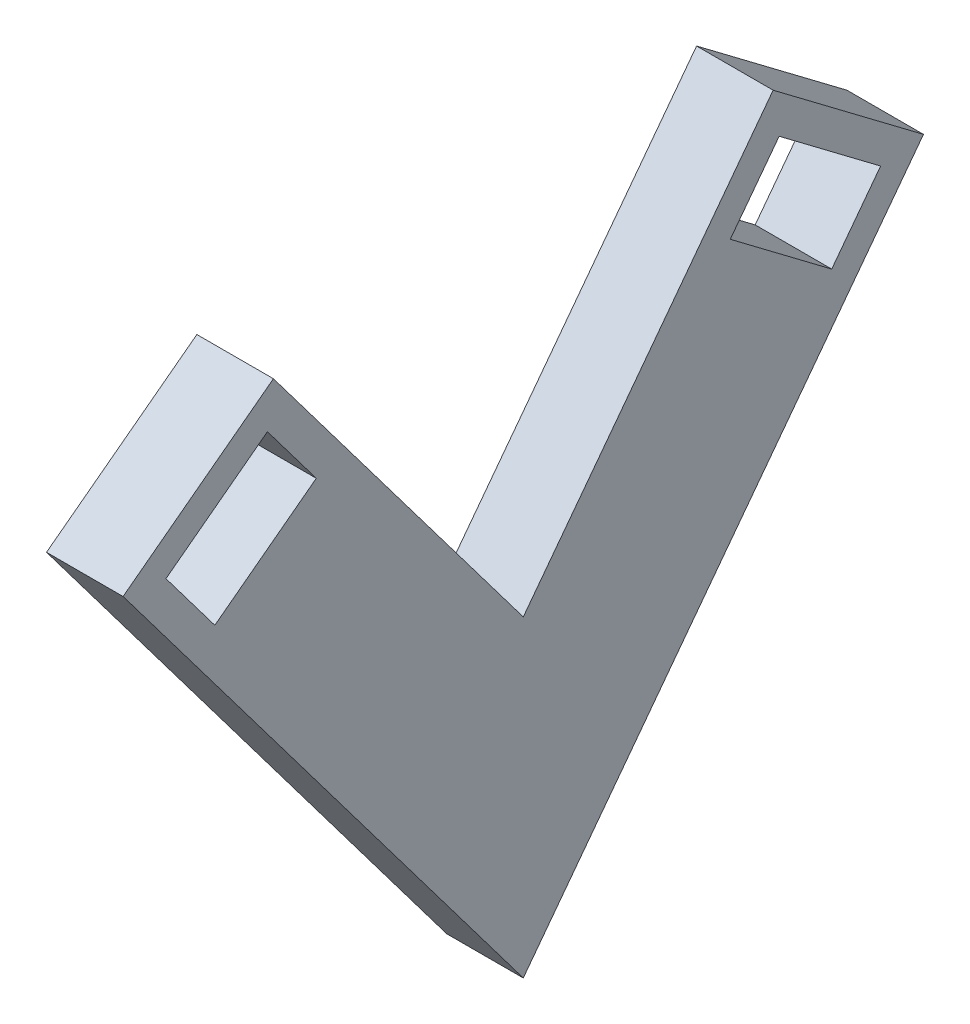
ISO-10303-21;
HEADER;
FILE_DESCRIPTION(('STEP AP214'),'2;1');
FILE_NAME('part.step','',(''),(''),'','','');
FILE_SCHEMA(('AUTOMOTIVE_DESIGN { 1 0 10303 214 1 1 1 1 }'));
ENDSEC;
DATA;
#1=APPLICATION_CONTEXT('core data for automotive mechanical design processes');
#2=APPLICATION_PROTOCOL_DEFINITION('international standard','automotive_design',2000,#1);
#3=PRODUCT_CONTEXT('',#1,'mechanical');
#4=PRODUCT('Part','Part','',(#3));
#5=PRODUCT_RELATED_PRODUCT_CATEGORY('part','',(#4));
#6=PRODUCT_DEFINITION_FORMATION('','',#4);
#7=PRODUCT_DEFINITION_CONTEXT('part definition',#1,'design');
#8=PRODUCT_DEFINITION('design','',#6,#7);
#9=PRODUCT_DEFINITION_SHAPE('','',#8);
#10=(LENGTH_UNIT() NAMED_UNIT(*) SI_UNIT(.MILLI.,.METRE.));
#11=(NAMED_UNIT(*) PLANE_ANGLE_UNIT() SI_UNIT($,.RADIAN.));
#12=(NAMED_UNIT(*) SI_UNIT($,.STERADIAN.) SOLID_ANGLE_UNIT());
#13=UNCERTAINTY_MEASURE_WITH_UNIT(LENGTH_MEASURE(1.E-05),#10,'distance_accuracy_value','');
#14=(GEOMETRIC_REPRESENTATION_CONTEXT(3) GLOBAL_UNCERTAINTY_ASSIGNED_CONTEXT((#13)) GLOBAL_UNIT_ASSIGNED_CONTEXT((#10,
#11,#12)) REPRESENTATION_CONTEXT('',''));
#15=CARTESIAN_POINT('',(0.,0.,0.));
#16=DIRECTION('',(0.,0.,1.));
#17=DIRECTION('',(1.,0.,0.));
#18=AXIS2_PLACEMENT_3D('',#15,#16,#17);
#19=CARTESIAN_POINT('',(5.,0.,0.));
#20=DIRECTION('',(1.,0.,0.));
#21=DIRECTION('',(0.,0.,-1.));
#22=AXIS2_PLACEMENT_3D('',#19,#20,#21);
#23=PLANE('',#22);
#24=DIRECTION('',(0.,-0.602233105212653,0.798320290977203));
#25=VECTOR('',#24,1.);
#26=CARTESIAN_POINT('',(5.,22.1160498707739,14.5742099507505));
#27=LINE('',#26,#25);
#28=CARTESIAN_POINT('',(5.,22.1160498707739,14.5742099507505));
#29=VERTEX_POINT('',#28);
#30=CARTESIAN_POINT('',(5.,14.7085826766583,24.3935495297701));
#31=VERTEX_POINT('',#30);
#32=EDGE_CURVE('E232',#29,#31,#27,.T.);
#33=ORIENTED_EDGE('',*,*,#32,.T.);
#34=DIRECTION('',(0.,-0.798320290977203,-0.602233105212653));
#35=VECTOR('',#34,1.);
#36=CARTESIAN_POINT('',(5.,14.7085826766583,24.3935495297701));
#37=LINE('',#36,#35);
#38=CARTESIAN_POINT('',(5.,-19.9404665601385,-1.74483721848573));
#39=VERTEX_POINT('',#38);
#40=EDGE_CURVE('E235',#31,#39,#37,.T.);
#41=ORIENTED_EDGE('',*,*,#40,.T.);
#42=DIRECTION('',(0.,-0.798320290977203,0.602233105212652));
#43=VECTOR('',#42,1.);
#44=CARTESIAN_POINT('',(5.,14.7085826766583,-27.8832239667415));
#45=LINE('',#44,#43);
#46=CARTESIAN_POINT('',(5.,14.7085826766583,-27.8832239667415));
#47=VERTEX_POINT('',#46);
#48=EDGE_CURVE('E183',#47,#39,#45,.T.);
#49=ORIENTED_EDGE('',*,*,#48,.F.);
#50=DIRECTION('',(0.,-0.602233105212652,-0.798320290977203));
#51=VECTOR('',#50,1.);
#52=CARTESIAN_POINT('',(5.,22.1160498707739,-18.0638843877219));
#53=LINE('',#52,#51);
#54=CARTESIAN_POINT('',(5.,22.1160498707739,-18.0638843877219));
#55=VERTEX_POINT('',#54);
#56=EDGE_CURVE('E180',#55,#47,#53,.T.);
#57=ORIENTED_EDGE('',*,*,#56,.F.);
#58=DIRECTION('',(0.,0.798320290977203,-0.602233105212652));
#59=VECTOR('',#58,1.);
#60=CARTESIAN_POINT('',(5.,22.1160498707739,-18.0638843877219));
#61=LINE('',#60,#59);
#62=CARTESIAN_POINT('',(5.,0.483518593677922,-1.74483721848573));
#63=VERTEX_POINT('',#62);
#64=EDGE_CURVE('E187',#63,#55,#61,.T.);
#65=ORIENTED_EDGE('',*,*,#64,.F.);
#66=DIRECTION('',(0.,0.798320290977203,0.602233105212652));
#67=VECTOR('',#66,1.);
#68=CARTESIAN_POINT('',(5.,22.1160498707739,14.5742099507505));
#69=LINE('',#68,#67);
#70=EDGE_CURVE('E238',#63,#29,#69,.T.);
#71=ORIENTED_EDGE('',*,*,#70,.T.);
#72=EDGE_LOOP('',(#33,#41,#49,#57,#65,#71));
#73=FACE_BOUND('',#72,.T.);
#74=DIRECTION('',(0.,0.602233105212653,-0.798320290977203));
#75=VECTOR('',#74,1.);
#76=CARTESIAN_POINT('',(5.,10.08531076295,18.4006072797633));
#77=LINE('',#76,#75);
#78=CARTESIAN_POINT('',(5.,10.08531076295,18.4006072797633));
#79=VERTEX_POINT('',#78);
#80=CARTESIAN_POINT('',(5.,15.083845536215,11.7745488646525));
#81=VERTEX_POINT('',#80);
#82=EDGE_CURVE('E208',#79,#81,#77,.T.);
#83=ORIENTED_EDGE('',*,*,#82,.F.);
#84=DIRECTION('',(0.,-0.798320290977203,-0.602233105212652));
#85=VECTOR('',#84,1.);
#86=CARTESIAN_POINT('',(5.,14.3164083051292,21.5924427373904));
#87=LINE('',#86,#85);
#88=CARTESIAN_POINT('',(5.,14.3164083051292,21.5924427373904));
#89=VERTEX_POINT('',#88);
#90=EDGE_CURVE('E206',#89,#79,#87,.T.);
#91=ORIENTED_EDGE('',*,*,#90,.F.);
#92=DIRECTION('',(0.,-0.602233105212652,0.798320290977203));
#93=VECTOR('',#92,1.);
#94=CARTESIAN_POINT('',(5.,19.3149430783942,14.9663843222796));
#95=LINE('',#94,#93);
#96=CARTESIAN_POINT('',(5.,19.3149430783942,14.9663843222796));
#97=VERTEX_POINT('',#96);
#98=EDGE_CURVE('E213',#97,#89,#95,.T.);
#99=ORIENTED_EDGE('',*,*,#98,.F.);
#100=DIRECTION('',(0.,0.798320290977203,0.602233105212652));
#101=VECTOR('',#100,1.);
#102=CARTESIAN_POINT('',(5.,15.083845536215,11.7745488646525));
#103=LINE('',#102,#101);
#104=EDGE_CURVE('E211',#81,#97,#103,.T.);
#105=ORIENTED_EDGE('',*,*,#104,.F.);
#106=EDGE_LOOP('',(#83,#91,#99,#105));
#107=FACE_BOUND('',#106,.T.);
#108=DIRECTION('',(0.,0.602233105212652,0.798320290977203));
#109=VECTOR('',#108,1.);
#110=CARTESIAN_POINT('',(5.,10.08531076295,-21.8902817167348));
#111=LINE('',#110,#109);
#112=CARTESIAN_POINT('',(5.,10.08531076295,-21.8902817167348));
#113=VERTEX_POINT('',#112);
#114=CARTESIAN_POINT('',(5.,15.083845536215,-15.264223301624));
#115=VERTEX_POINT('',#114);
#116=EDGE_CURVE('E155',#113,#115,#111,.T.);
#117=ORIENTED_EDGE('',*,*,#116,.T.);
#118=DIRECTION('',(0.,0.798320290977204,-0.602233105212652));
#119=VECTOR('',#118,1.);
#120=CARTESIAN_POINT('',(5.,15.083845536215,-15.264223301624));
#121=LINE('',#120,#119);
#122=CARTESIAN_POINT('',(5.,19.3149430783942,-18.456058759251));
#123=VERTEX_POINT('',#122);
#124=EDGE_CURVE('E162',#115,#123,#121,.T.);
#125=ORIENTED_EDGE('',*,*,#124,.T.);
#126=DIRECTION('',(0.,-0.602233105212652,-0.798320290977203));
#127=VECTOR('',#126,1.);
#128=CARTESIAN_POINT('',(5.,19.3149430783942,-18.456058759251));
#129=LINE('',#128,#127);
#130=CARTESIAN_POINT('',(5.,14.3164083051292,-25.0821171743618));
#131=VERTEX_POINT('',#130);
#132=EDGE_CURVE('E157',#123,#131,#129,.T.);
#133=ORIENTED_EDGE('',*,*,#132,.T.);
#134=DIRECTION('',(0.,-0.798320290977203,0.602233105212652));
#135=VECTOR('',#134,1.);
#136=CARTESIAN_POINT('',(5.,14.3164083051292,-25.0821171743618));
#137=LINE('',#136,#135);
#138=EDGE_CURVE('E141',#131,#113,#137,.T.);
#139=ORIENTED_EDGE('',*,*,#138,.T.);
#140=EDGE_LOOP('',(#117,#125,#133,#139));
#141=FACE_BOUND('',#140,.T.);
#142=ADVANCED_FACE('F35',(#73,#107,#141),#23,.T.);
#143=CARTESIAN_POINT('',(0.,0.,0.));
#144=DIRECTION('',(1.,0.,0.));
#145=DIRECTION('',(0.,0.,-1.));
#146=AXIS2_PLACEMENT_3D('',#143,#144,#145);
#147=PLANE('',#146);
#148=DIRECTION('',(0.,-0.602233105212653,0.798320290977203));
#149=VECTOR('',#148,1.);
#150=CARTESIAN_POINT('',(0.,22.1160498707739,14.5742099507505));
#151=LINE('',#150,#149);
#152=CARTESIAN_POINT('',(0.,22.1160498707739,14.5742099507505));
#153=VERTEX_POINT('',#152);
#154=CARTESIAN_POINT('',(0.,14.7085826766583,24.3935495297701));
#155=VERTEX_POINT('',#154);
#156=EDGE_CURVE('E231',#153,#155,#151,.T.);
#157=ORIENTED_EDGE('',*,*,#156,.F.);
#158=DIRECTION('',(0.,0.798320290977203,0.602233105212652));
#159=VECTOR('',#158,1.);
#160=CARTESIAN_POINT('',(0.,22.1160498707739,14.5742099507505));
#161=LINE('',#160,#159);
#162=CARTESIAN_POINT('',(0.,0.483518593677922,-1.74483721848573));
#163=VERTEX_POINT('',#162);
#164=EDGE_CURVE('E236',#163,#153,#161,.T.);
#165=ORIENTED_EDGE('',*,*,#164,.F.);
#166=DIRECTION('',(0.,0.798320290977203,-0.602233105212652));
#167=VECTOR('',#166,1.);
#168=CARTESIAN_POINT('',(0.,22.1160498707739,-18.0638843877219));
#169=LINE('',#168,#167);
#170=CARTESIAN_POINT('',(0.,22.1160498707739,-18.0638843877219));
#171=VERTEX_POINT('',#170);
#172=EDGE_CURVE('E184',#163,#171,#169,.T.);
#173=ORIENTED_EDGE('',*,*,#172,.T.);
#174=DIRECTION('',(0.,-0.602233105212652,-0.798320290977203));
#175=VECTOR('',#174,1.);
#176=CARTESIAN_POINT('',(0.,22.1160498707739,-18.0638843877219));
#177=LINE('',#176,#175);
#178=CARTESIAN_POINT('',(0.,14.7085826766583,-27.8832239667415));
#179=VERTEX_POINT('',#178);
#180=EDGE_CURVE('E149',#171,#179,#177,.T.);
#181=ORIENTED_EDGE('',*,*,#180,.T.);
#182=DIRECTION('',(0.,-0.798320290977203,0.602233105212652));
#183=VECTOR('',#182,1.);
#184=CARTESIAN_POINT('',(0.,14.7085826766583,-27.8832239667415));
#185=LINE('',#184,#183);
#186=CARTESIAN_POINT('',(0.,-19.9404665601385,-1.74483721848573));
#187=VERTEX_POINT('',#186);
#188=EDGE_CURVE('E193',#179,#187,#185,.T.);
#189=ORIENTED_EDGE('',*,*,#188,.T.);
#190=DIRECTION('',(0.,-0.798320290977203,-0.602233105212653));
#191=VECTOR('',#190,1.);
#192=CARTESIAN_POINT('',(0.,14.7085826766583,24.3935495297701));
#193=LINE('',#192,#191);
#194=EDGE_CURVE('E242',#155,#187,#193,.T.);
#195=ORIENTED_EDGE('',*,*,#194,.F.);
#196=EDGE_LOOP('',(#157,#165,#173,#181,#189,#195));
#197=FACE_BOUND('',#196,.T.);
#198=DIRECTION('',(0.,-0.798320290977203,-0.602233105212652));
#199=VECTOR('',#198,1.);
#200=CARTESIAN_POINT('',(0.,14.3164083051292,21.5924427373904));
#201=LINE('',#200,#199);
#202=CARTESIAN_POINT('',(0.,14.3164083051292,21.5924427373904));
#203=VERTEX_POINT('',#202);
#204=CARTESIAN_POINT('',(0.,10.08531076295,18.4006072797633));
#205=VERTEX_POINT('',#204);
#206=EDGE_CURVE('E58',#203,#205,#201,.T.);
#207=ORIENTED_EDGE('',*,*,#206,.T.);
#208=DIRECTION('',(0.,0.602233105212653,-0.798320290977203));
#209=VECTOR('',#208,1.);
#210=CARTESIAN_POINT('',(0.,10.08531076295,18.4006072797633));
#211=LINE('',#210,#209);
#212=CARTESIAN_POINT('',(0.,15.083845536215,11.7745488646525));
#213=VERTEX_POINT('',#212);
#214=EDGE_CURVE('E217',#205,#213,#211,.T.);
#215=ORIENTED_EDGE('',*,*,#214,.T.);
#216=DIRECTION('',(0.,0.798320290977203,0.602233105212652));
#217=VECTOR('',#216,1.);
#218=CARTESIAN_POINT('',(0.,15.083845536215,11.7745488646525));
#219=LINE('',#218,#217);
#220=CARTESIAN_POINT('',(0.,19.3149430783942,14.9663843222796));
#221=VERTEX_POINT('',#220);
#222=EDGE_CURVE('E220',#213,#221,#219,.T.);
#223=ORIENTED_EDGE('',*,*,#222,.T.);
#224=DIRECTION('',(0.,-0.602233105212652,0.798320290977203));
#225=VECTOR('',#224,1.);
#226=CARTESIAN_POINT('',(0.,19.3149430783942,14.9663843222796));
#227=LINE('',#226,#225);
#228=EDGE_CURVE('E209',#221,#203,#227,.T.);
#229=ORIENTED_EDGE('',*,*,#228,.T.);
#230=EDGE_LOOP('',(#207,#215,#223,#229));
#231=FACE_BOUND('',#230,.T.);
#232=DIRECTION('',(0.,-0.798320290977203,0.602233105212652));
#233=VECTOR('',#232,1.);
#234=CARTESIAN_POINT('',(0.,14.3164083051292,-25.0821171743618));
#235=LINE('',#234,#233);
#236=CARTESIAN_POINT('',(0.,14.3164083051292,-25.0821171743618));
#237=VERTEX_POINT('',#236);
#238=CARTESIAN_POINT('',(0.,10.08531076295,-21.8902817167348));
#239=VERTEX_POINT('',#238);
#240=EDGE_CURVE('E144',#237,#239,#235,.T.);
#241=ORIENTED_EDGE('',*,*,#240,.F.);
#242=DIRECTION('',(0.,-0.602233105212652,-0.798320290977203));
#243=VECTOR('',#242,1.);
#244=CARTESIAN_POINT('',(0.,19.3149430783942,-18.456058759251));
#245=LINE('',#244,#243);
#246=CARTESIAN_POINT('',(0.,19.3149430783942,-18.456058759251));
#247=VERTEX_POINT('',#246);
#248=EDGE_CURVE('E158',#247,#237,#245,.T.);
#249=ORIENTED_EDGE('',*,*,#248,.F.);
#250=DIRECTION('',(0.,0.798320290977204,-0.602233105212652));
#251=VECTOR('',#250,1.);
#252=CARTESIAN_POINT('',(0.,15.083845536215,-15.264223301624));
#253=LINE('',#252,#251);
#254=CARTESIAN_POINT('',(0.,15.083845536215,-15.264223301624));
#255=VERTEX_POINT('',#254);
#256=EDGE_CURVE('E171',#255,#247,#253,.T.);
#257=ORIENTED_EDGE('',*,*,#256,.F.);
#258=DIRECTION('',(0.,0.602233105212652,0.798320290977203));
#259=VECTOR('',#258,1.);
#260=CARTESIAN_POINT('',(0.,10.08531076295,-21.8902817167348));
#261=LINE('',#260,#259);
#262=EDGE_CURVE('E169',#239,#255,#261,.T.);
#263=ORIENTED_EDGE('',*,*,#262,.F.);
#264=EDGE_LOOP('',(#241,#249,#257,#263));
#265=FACE_BOUND('',#264,.T.);
#266=ADVANCED_FACE('F253',(#197,#231,#265),#147,.F.);
#267=CARTESIAN_POINT('',(5.,22.1160498707739,14.5742099507505));
#268=DIRECTION('',(0.,-0.798320290977203,-0.602233105212653));
#269=DIRECTION('',(0.,0.602233105212653,-0.798320290977203));
#270=AXIS2_PLACEMENT_3D('',#267,#268,#269);
#271=PLANE('',#270);
#272=ORIENTED_EDGE('',*,*,#156,.T.);
#273=DIRECTION('',(-1.,0.,0.));
#274=VECTOR('',#273,1.);
#275=CARTESIAN_POINT('',(5.,14.7085826766583,24.3935495297701));
#276=LINE('',#275,#274);
#277=EDGE_CURVE('E11',#31,#155,#276,.T.);
#278=ORIENTED_EDGE('',*,*,#277,.F.);
#279=ORIENTED_EDGE('',*,*,#32,.F.);
#280=DIRECTION('',(-1.,0.,0.));
#281=VECTOR('',#280,1.);
#282=CARTESIAN_POINT('',(5.,22.1160498707739,14.5742099507505));
#283=LINE('',#282,#281);
#284=EDGE_CURVE('E43',#29,#153,#283,.T.);
#285=ORIENTED_EDGE('',*,*,#284,.T.);
#286=EDGE_LOOP('',(#272,#278,#279,#285));
#287=FACE_BOUND('',#286,.T.);
#288=ADVANCED_FACE('F37',(#287),#271,.F.);
#289=CARTESIAN_POINT('',(5.,14.7085826766583,24.3935495297701));
#290=DIRECTION('',(0.,0.602233105212653,-0.798320290977203));
#291=DIRECTION('',(0.,0.798320290977203,0.602233105212653));
#292=AXIS2_PLACEMENT_3D('',#289,#290,#291);
#293=PLANE('',#292);
#294=ORIENTED_EDGE('',*,*,#194,.T.);
#295=DIRECTION('',(-1.,0.,0.));
#296=VECTOR('',#295,1.);
#297=CARTESIAN_POINT('',(5.,-19.9404665601385,-1.74483721848573));
#298=LINE('',#297,#296);
#299=EDGE_CURVE('E201',#39,#187,#298,.T.);
#300=ORIENTED_EDGE('',*,*,#299,.F.);
#301=ORIENTED_EDGE('',*,*,#40,.F.);
#302=ORIENTED_EDGE('',*,*,#277,.T.);
#303=EDGE_LOOP('',(#294,#300,#301,#302));
#304=FACE_BOUND('',#303,.T.);
#305=ADVANCED_FACE('F259',(#304),#293,.F.);
#306=CARTESIAN_POINT('',(5.,22.1160498707739,14.5742099507505));
#307=DIRECTION('',(0.,-0.602233105212652,0.798320290977203));
#308=DIRECTION('',(0.,-0.798320290977203,-0.602233105212652));
#309=AXIS2_PLACEMENT_3D('',#306,#307,#308);
#310=PLANE('',#309);
#311=ORIENTED_EDGE('',*,*,#164,.T.);
#312=ORIENTED_EDGE('',*,*,#284,.F.);
#313=ORIENTED_EDGE('',*,*,#70,.F.);
#314=DIRECTION('',(-1.,0.,0.));
#315=VECTOR('',#314,1.);
#316=CARTESIAN_POINT('',(5.,0.483518593677922,-1.74483721848573));
#317=LINE('',#316,#315);
#318=EDGE_CURVE('E199',#63,#163,#317,.T.);
#319=ORIENTED_EDGE('',*,*,#318,.T.);
#320=EDGE_LOOP('',(#311,#312,#313,#319));
#321=FACE_BOUND('',#320,.T.);
#322=ADVANCED_FACE('F266',(#321),#310,.F.);
#323=CARTESIAN_POINT('',(5.,14.3164083051292,21.5924427373904));
#324=DIRECTION('',(0.,0.602233105212652,-0.798320290977203));
#325=DIRECTION('',(0.,0.798320290977203,0.602233105212653));
#326=AXIS2_PLACEMENT_3D('',#323,#324,#325);
#327=PLANE('',#326);
#328=ORIENTED_EDGE('',*,*,#206,.F.);
#329=DIRECTION('',(-1.,0.,0.));
#330=VECTOR('',#329,1.);
#331=CARTESIAN_POINT('',(5.,14.3164083051292,21.5924427373904));
#332=LINE('',#331,#330);
#333=EDGE_CURVE('E215',#89,#203,#332,.T.);
#334=ORIENTED_EDGE('',*,*,#333,.F.);
#335=ORIENTED_EDGE('',*,*,#90,.T.);
#336=DIRECTION('',(-1.,0.,0.));
#337=VECTOR('',#336,1.);
#338=CARTESIAN_POINT('',(5.,10.08531076295,18.4006072797633));
#339=LINE('',#338,#337);
#340=EDGE_CURVE('E229',#79,#205,#339,.T.);
#341=ORIENTED_EDGE('',*,*,#340,.T.);
#342=EDGE_LOOP('',(#328,#334,#335,#341));
#343=FACE_BOUND('',#342,.T.);
#344=ADVANCED_FACE('F290',(#343),#327,.T.);
#345=CARTESIAN_POINT('',(5.,10.08531076295,18.4006072797633));
#346=DIRECTION('',(0.,0.798320290977203,0.602233105212653));
#347=DIRECTION('',(0.,-0.602233105212653,0.798320290977203));
#348=AXIS2_PLACEMENT_3D('',#345,#346,#347);
#349=PLANE('',#348);
#350=ORIENTED_EDGE('',*,*,#214,.F.);
#351=ORIENTED_EDGE('',*,*,#340,.F.);
#352=ORIENTED_EDGE('',*,*,#82,.T.);
#353=DIRECTION('',(-1.,0.,0.));
#354=VECTOR('',#353,1.);
#355=CARTESIAN_POINT('',(5.,15.083845536215,11.7745488646525));
#356=LINE('',#355,#354);
#357=EDGE_CURVE('E227',#81,#213,#356,.T.);
#358=ORIENTED_EDGE('',*,*,#357,.T.);
#359=EDGE_LOOP('',(#350,#351,#352,#358));
#360=FACE_BOUND('',#359,.T.);
#361=ADVANCED_FACE('F392',(#360),#349,.T.);
#362=CARTESIAN_POINT('',(5.,15.083845536215,11.7745488646525));
#363=DIRECTION('',(0.,-0.602233105212652,0.798320290977203));
#364=DIRECTION('',(0.,-0.798320290977203,-0.602233105212652));
#365=AXIS2_PLACEMENT_3D('',#362,#363,#364);
#366=PLANE('',#365);
#367=ORIENTED_EDGE('',*,*,#222,.F.);
#368=ORIENTED_EDGE('',*,*,#357,.F.);
#369=ORIENTED_EDGE('',*,*,#104,.T.);
#370=DIRECTION('',(-1.,0.,0.));
#371=VECTOR('',#370,1.);
#372=CARTESIAN_POINT('',(5.,19.3149430783942,14.9663843222796));
#373=LINE('',#372,#371);
#374=EDGE_CURVE('E50',#97,#221,#373,.T.);
#375=ORIENTED_EDGE('',*,*,#374,.T.);
#376=EDGE_LOOP('',(#367,#368,#369,#375));
#377=FACE_BOUND('',#376,.T.);
#378=ADVANCED_FACE('F385',(#377),#366,.T.);
#379=CARTESIAN_POINT('',(5.,19.3149430783942,14.9663843222796));
#380=DIRECTION('',(0.,-0.798320290977203,-0.602233105212652));
#381=DIRECTION('',(0.,0.602233105212653,-0.798320290977203));
#382=AXIS2_PLACEMENT_3D('',#379,#380,#381);
#383=PLANE('',#382);
#384=ORIENTED_EDGE('',*,*,#228,.F.);
#385=ORIENTED_EDGE('',*,*,#374,.F.);
#386=ORIENTED_EDGE('',*,*,#98,.T.);
#387=ORIENTED_EDGE('',*,*,#333,.T.);
#388=EDGE_LOOP('',(#384,#385,#386,#387));
#389=FACE_BOUND('',#388,.T.);
#390=ADVANCED_FACE('F281',(#389),#383,.T.);
#391=CARTESIAN_POINT('',(5.,22.1160498707739,-18.0638843877219));
#392=DIRECTION('',(0.,-0.798320290977203,0.602233105212652));
#393=DIRECTION('',(0.,0.602233105212653,0.798320290977203));
#394=AXIS2_PLACEMENT_3D('',#391,#392,#393);
#395=PLANE('',#394);
#396=ORIENTED_EDGE('',*,*,#180,.F.);
#397=DIRECTION('',(-1.,0.,0.));
#398=VECTOR('',#397,1.);
#399=CARTESIAN_POINT('',(5.,22.1160498707739,-18.0638843877219));
#400=LINE('',#399,#398);
#401=EDGE_CURVE('E190',#55,#171,#400,.T.);
#402=ORIENTED_EDGE('',*,*,#401,.F.);
#403=ORIENTED_EDGE('',*,*,#56,.T.);
#404=DIRECTION('',(-1.,0.,0.));
#405=VECTOR('',#404,1.);
#406=CARTESIAN_POINT('',(5.,14.7085826766583,-27.8832239667415));
#407=LINE('',#406,#405);
#408=EDGE_CURVE('E204',#47,#179,#407,.T.);
#409=ORIENTED_EDGE('',*,*,#408,.T.);
#410=EDGE_LOOP('',(#396,#402,#403,#409));
#411=FACE_BOUND('',#410,.T.);
#412=ADVANCED_FACE('F271',(#411),#395,.F.);
#413=CARTESIAN_POINT('',(5.,14.7085826766583,-27.8832239667415));
#414=DIRECTION('',(0.,0.602233105212652,0.798320290977203));
#415=DIRECTION('',(0.,0.798320290977203,-0.602233105212652));
#416=AXIS2_PLACEMENT_3D('',#413,#414,#415);
#417=PLANE('',#416);
#418=ORIENTED_EDGE('',*,*,#188,.F.);
#419=ORIENTED_EDGE('',*,*,#408,.F.);
#420=ORIENTED_EDGE('',*,*,#48,.T.);
#421=ORIENTED_EDGE('',*,*,#299,.T.);
#422=EDGE_LOOP('',(#418,#419,#420,#421));
#423=FACE_BOUND('',#422,.T.);
#424=ADVANCED_FACE('F273',(#423),#417,.F.);
#425=CARTESIAN_POINT('',(5.,22.1160498707739,-18.0638843877219));
#426=DIRECTION('',(0.,-0.602233105212652,-0.798320290977203));
#427=DIRECTION('',(0.,-0.798320290977203,0.602233105212652));
#428=AXIS2_PLACEMENT_3D('',#425,#426,#427);
#429=PLANE('',#428);
#430=ORIENTED_EDGE('',*,*,#172,.F.);
#431=ORIENTED_EDGE('',*,*,#318,.F.);
#432=ORIENTED_EDGE('',*,*,#64,.T.);
#433=ORIENTED_EDGE('',*,*,#401,.T.);
#434=EDGE_LOOP('',(#430,#431,#432,#433));
#435=FACE_BOUND('',#434,.T.);
#436=ADVANCED_FACE('F268',(#435),#429,.F.);
#437=CARTESIAN_POINT('',(5.,14.3164083051292,-25.0821171743618));
#438=DIRECTION('',(0.,0.602233105212652,0.798320290977203));
#439=DIRECTION('',(0.,0.798320290977203,-0.602233105212652));
#440=AXIS2_PLACEMENT_3D('',#437,#438,#439);
#441=PLANE('',#440);
#442=ORIENTED_EDGE('',*,*,#240,.T.);
#443=DIRECTION('',(-1.,0.,0.));
#444=VECTOR('',#443,1.);
#445=CARTESIAN_POINT('',(5.,10.08531076295,-21.8902817167348));
#446=LINE('',#445,#444);
#447=EDGE_CURVE('E138',#113,#239,#446,.T.);
#448=ORIENTED_EDGE('',*,*,#447,.F.);
#449=ORIENTED_EDGE('',*,*,#138,.F.);
#450=DIRECTION('',(-1.,0.,0.));
#451=VECTOR('',#450,1.);
#452=CARTESIAN_POINT('',(5.,14.3164083051292,-25.0821171743618));
#453=LINE('',#452,#451);
#454=EDGE_CURVE('E167',#131,#237,#453,.T.);
#455=ORIENTED_EDGE('',*,*,#454,.T.);
#456=EDGE_LOOP('',(#442,#448,#449,#455));
#457=FACE_BOUND('',#456,.T.);
#458=ADVANCED_FACE('F140',(#457),#441,.T.);
#459=CARTESIAN_POINT('',(5.,10.08531076295,-21.8902817167348));
#460=DIRECTION('',(0.,0.798320290977203,-0.602233105212652));
#461=DIRECTION('',(0.,-0.602233105212652,-0.798320290977203));
#462=AXIS2_PLACEMENT_3D('',#459,#460,#461);
#463=PLANE('',#462);
#464=ORIENTED_EDGE('',*,*,#262,.T.);
#465=DIRECTION('',(-1.,0.,0.));
#466=VECTOR('',#465,1.);
#467=CARTESIAN_POINT('',(5.,15.083845536215,-15.264223301624));
#468=LINE('',#467,#466);
#469=EDGE_CURVE('E150',#115,#255,#468,.T.);
#470=ORIENTED_EDGE('',*,*,#469,.F.);
#471=ORIENTED_EDGE('',*,*,#116,.F.);
#472=ORIENTED_EDGE('',*,*,#447,.T.);
#473=EDGE_LOOP('',(#464,#470,#471,#472));
#474=FACE_BOUND('',#473,.T.);
#475=ADVANCED_FACE('F160',(#474),#463,.T.);
#476=CARTESIAN_POINT('',(5.,15.083845536215,-15.264223301624));
#477=DIRECTION('',(0.,-0.602233105212652,-0.798320290977203));
#478=DIRECTION('',(0.,-0.798320290977203,0.602233105212652));
#479=AXIS2_PLACEMENT_3D('',#476,#477,#478);
#480=PLANE('',#479);
#481=ORIENTED_EDGE('',*,*,#256,.T.);
#482=DIRECTION('',(-1.,0.,0.));
#483=VECTOR('',#482,1.);
#484=CARTESIAN_POINT('',(5.,19.3149430783942,-18.456058759251));
#485=LINE('',#484,#483);
#486=EDGE_CURVE('E177',#123,#247,#485,.T.);
#487=ORIENTED_EDGE('',*,*,#486,.F.);
#488=ORIENTED_EDGE('',*,*,#124,.F.);
#489=ORIENTED_EDGE('',*,*,#469,.T.);
#490=EDGE_LOOP('',(#481,#487,#488,#489));
#491=FACE_BOUND('',#490,.T.);
#492=ADVANCED_FACE('F356',(#491),#480,.T.);
#493=CARTESIAN_POINT('',(5.,19.3149430783942,-18.456058759251));
#494=DIRECTION('',(0.,-0.798320290977203,0.602233105212652));
#495=DIRECTION('',(0.,0.602233105212652,0.798320290977203));
#496=AXIS2_PLACEMENT_3D('',#493,#494,#495);
#497=PLANE('',#496);
#498=ORIENTED_EDGE('',*,*,#248,.T.);
#499=ORIENTED_EDGE('',*,*,#454,.F.);
#500=ORIENTED_EDGE('',*,*,#132,.F.);
#501=ORIENTED_EDGE('',*,*,#486,.T.);
#502=EDGE_LOOP('',(#498,#499,#500,#501));
#503=FACE_BOUND('',#502,.T.);
#504=ADVANCED_FACE('F365',(#503),#497,.T.);
#505=CLOSED_SHELL('',(#142,#266,#288,#305,#322,#344,#361,#378,#390,#412,#424,#436,#458,#475,
#492,#504));
#506=MANIFOLD_SOLID_BREP('B2',#505);
#507=ADVANCED_BREP_SHAPE_REPRESENTATION('',(#18,#506),#14);
#508=SHAPE_DEFINITION_REPRESENTATION(#9,#507);
ENDSEC;
END-ISO-10303-21;
